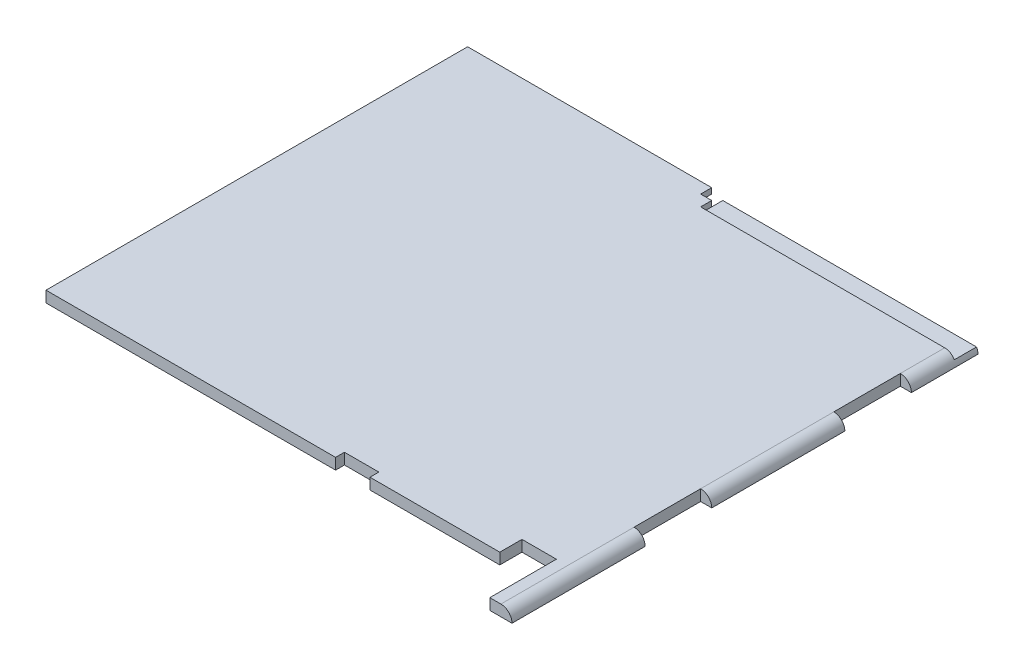
ISO-10303-21;
HEADER;
FILE_DESCRIPTION(('STEP AP214'),'2;1');
FILE_NAME('part.step','',(''),(''),'','','');
FILE_SCHEMA(('AUTOMOTIVE_DESIGN { 1 0 10303 214 1 1 1 1 }'));
ENDSEC;
DATA;
#1=APPLICATION_CONTEXT('core data for automotive mechanical design processes');
#2=APPLICATION_PROTOCOL_DEFINITION('international standard','automotive_design',2000,#1);
#3=PRODUCT_CONTEXT('',#1,'mechanical');
#4=PRODUCT('Part','Part','',(#3));
#5=PRODUCT_RELATED_PRODUCT_CATEGORY('part','',(#4));
#6=PRODUCT_DEFINITION_FORMATION('','',#4);
#7=PRODUCT_DEFINITION_CONTEXT('part definition',#1,'design');
#8=PRODUCT_DEFINITION('design','',#6,#7);
#9=PRODUCT_DEFINITION_SHAPE('','',#8);
#10=(LENGTH_UNIT() NAMED_UNIT(*) SI_UNIT(.MILLI.,.METRE.));
#11=(NAMED_UNIT(*) PLANE_ANGLE_UNIT() SI_UNIT($,.RADIAN.));
#12=(NAMED_UNIT(*) SI_UNIT($,.STERADIAN.) SOLID_ANGLE_UNIT());
#13=UNCERTAINTY_MEASURE_WITH_UNIT(LENGTH_MEASURE(1.E-05),#10,'distance_accuracy_value','');
#14=(GEOMETRIC_REPRESENTATION_CONTEXT(3) GLOBAL_UNCERTAINTY_ASSIGNED_CONTEXT((#13)) GLOBAL_UNIT_ASSIGNED_CONTEXT((#10,
#11,#12)) REPRESENTATION_CONTEXT('',''));
#15=CARTESIAN_POINT('',(0.,0.,0.));
#16=DIRECTION('',(0.,0.,1.));
#17=DIRECTION('',(1.,0.,0.));
#18=AXIS2_PLACEMENT_3D('',#15,#16,#17);
#19=CARTESIAN_POINT('',(-36.2537132824313,0.,76.4649026606249));
#20=DIRECTION('',(0.,0.,1.));
#21=DIRECTION('',(1.,0.,0.));
#22=AXIS2_PLACEMENT_3D('',#19,#20,#21);
#23=PLANE('',#22);
#24=DIRECTION('',(1.,0.,0.));
#25=VECTOR('',#24,1.);
#26=CARTESIAN_POINT('',(-36.2537132824313,0.,76.4649026606249));
#27=LINE('',#26,#25);
#28=CARTESIAN_POINT('',(93.7462867175687,0.,76.4649026606249));
#29=VERTEX_POINT('',#28);
#30=CARTESIAN_POINT('',(208.746286717569,0.,76.4649026606249));
#31=VERTEX_POINT('',#30);
#32=EDGE_CURVE('E652',#29,#31,#27,.T.);
#33=ORIENTED_EDGE('',*,*,#32,.F.);
#34=DIRECTION('',(0.,-1.,0.));
#35=VECTOR('',#34,1.);
#36=CARTESIAN_POINT('',(93.7462867175687,5.,76.4649026606249));
#37=LINE('',#36,#35);
#38=CARTESIAN_POINT('',(93.7462867175687,2.5,76.4649026606249));
#39=VERTEX_POINT('',#38);
#40=EDGE_CURVE('E596',#39,#29,#37,.T.);
#41=ORIENTED_EDGE('',*,*,#40,.F.);
#42=DIRECTION('',(1.,0.,0.));
#43=VECTOR('',#42,1.);
#44=CARTESIAN_POINT('',(-36.2537132824313,2.50000000000002,76.4649026606249));
#45=LINE('',#44,#43);
#46=CARTESIAN_POINT('',(208.076413736491,2.49999999999999,76.4649026606249));
#47=VERTEX_POINT('',#46);
#48=EDGE_CURVE('E410',#39,#47,#45,.T.);
#49=ORIENTED_EDGE('',*,*,#48,.T.);
#50=CARTESIAN_POINT('',(203.746286717569,0.,76.4649026606249));
#51=DIRECTION('',(0.,0.,1.));
#52=DIRECTION('',(1.,0.,0.));
#53=AXIS2_PLACEMENT_3D('',#50,#51,#52);
#54=CIRCLE('',#53,5.);
#55=EDGE_CURVE('E791',#47,#31,#54,.F.);
#56=ORIENTED_EDGE('',*,*,#55,.T.);
#57=EDGE_LOOP('',(#33,#41,#49,#56));
#58=FACE_BOUND('',#57,.T.);
#59=ADVANCED_FACE('F402',(#58),#23,.F.);
#60=CARTESIAN_POINT('',(93.7462867175687,2.5,86.4649026606249));
#61=DIRECTION('',(-1.,0.,0.));
#62=DIRECTION('',(0.,0.,1.));
#63=AXIS2_PLACEMENT_3D('',#60,#61,#62);
#64=PLANE('',#63);
#65=DIRECTION('',(0.,-1.,0.));
#66=VECTOR('',#65,1.);
#67=CARTESIAN_POINT('',(93.7462867175687,5.,81.4649026606249));
#68=LINE('',#67,#66);
#69=CARTESIAN_POINT('',(93.7462867175687,5.,81.4649026606249));
#70=VERTEX_POINT('',#69);
#71=CARTESIAN_POINT('',(93.7462867175687,2.5,81.4649026606249));
#72=VERTEX_POINT('',#71);
#73=EDGE_CURVE('E587',#70,#72,#68,.T.);
#74=ORIENTED_EDGE('',*,*,#73,.F.);
#75=DIRECTION('',(0.,0.,-1.));
#76=VECTOR('',#75,1.);
#77=CARTESIAN_POINT('',(93.7462867175687,5.,86.4649026606249));
#78=LINE('',#77,#76);
#79=CARTESIAN_POINT('',(93.7462867175687,5.,86.4649026606249));
#80=VERTEX_POINT('',#79);
#81=EDGE_CURVE('E638',#80,#70,#78,.T.);
#82=ORIENTED_EDGE('',*,*,#81,.F.);
#83=DIRECTION('',(0.,1.,0.));
#84=VECTOR('',#83,1.);
#85=CARTESIAN_POINT('',(93.7462867175687,2.5,86.4649026606249));
#86=LINE('',#85,#84);
#87=CARTESIAN_POINT('',(93.7462867175687,2.5,86.4649026606249));
#88=VERTEX_POINT('',#87);
#89=EDGE_CURVE('E631',#88,#80,#86,.T.);
#90=ORIENTED_EDGE('',*,*,#89,.F.);
#91=DIRECTION('',(0.,0.,-1.));
#92=VECTOR('',#91,1.);
#93=CARTESIAN_POINT('',(93.7462867175687,2.5,86.4649026606249));
#94=LINE('',#93,#92);
#95=EDGE_CURVE('E642',#88,#72,#94,.T.);
#96=ORIENTED_EDGE('',*,*,#95,.T.);
#97=EDGE_LOOP('',(#74,#82,#90,#96));
#98=FACE_BOUND('',#97,.T.);
#99=ADVANCED_FACE('F896',(#98),#64,.F.);
#100=CARTESIAN_POINT('',(88.7462867175687,0.,86.4649026606249));
#101=DIRECTION('',(1.,0.,0.));
#102=DIRECTION('',(0.,0.,-1.));
#103=AXIS2_PLACEMENT_3D('',#100,#101,#102);
#104=PLANE('',#103);
#105=DIRECTION('',(0.,1.,0.));
#106=VECTOR('',#105,1.);
#107=CARTESIAN_POINT('',(88.7462867175687,5.,81.4649026606249));
#108=LINE('',#107,#106);
#109=CARTESIAN_POINT('',(88.7462867175687,0.,81.4649026606249));
#110=VERTEX_POINT('',#109);
#111=CARTESIAN_POINT('',(88.7462867175687,2.5,81.4649026606249));
#112=VERTEX_POINT('',#111);
#113=EDGE_CURVE('E417',#110,#112,#108,.T.);
#114=ORIENTED_EDGE('',*,*,#113,.F.);
#115=DIRECTION('',(0.,0.,-1.));
#116=VECTOR('',#115,1.);
#117=CARTESIAN_POINT('',(88.7462867175687,0.,86.4649026606249));
#118=LINE('',#117,#116);
#119=CARTESIAN_POINT('',(88.7462867175687,0.,86.4649026606249));
#120=VERTEX_POINT('',#119);
#121=EDGE_CURVE('E605',#120,#110,#118,.T.);
#122=ORIENTED_EDGE('',*,*,#121,.F.);
#123=DIRECTION('',(0.,-1.,0.));
#124=VECTOR('',#123,1.);
#125=CARTESIAN_POINT('',(88.7462867175687,0.,86.4649026606249));
#126=LINE('',#125,#124);
#127=CARTESIAN_POINT('',(88.7462867175687,2.5,86.4649026606249));
#128=VERTEX_POINT('',#127);
#129=EDGE_CURVE('E623',#128,#120,#126,.T.);
#130=ORIENTED_EDGE('',*,*,#129,.F.);
#131=DIRECTION('',(0.,0.,-1.));
#132=VECTOR('',#131,1.);
#133=CARTESIAN_POINT('',(88.7462867175687,2.5,86.4649026606249));
#134=LINE('',#133,#132);
#135=EDGE_CURVE('E633',#128,#112,#134,.T.);
#136=ORIENTED_EDGE('',*,*,#135,.T.);
#137=EDGE_LOOP('',(#114,#122,#130,#136));
#138=FACE_BOUND('',#137,.T.);
#139=ADVANCED_FACE('F880',(#138),#104,.F.);
#140=CARTESIAN_POINT('',(0.,5.,286.464902660625));
#141=DIRECTION('',(0.,0.,-1.));
#142=DIRECTION('',(-1.,0.,0.));
#143=AXIS2_PLACEMENT_3D('',#140,#141,#142);
#144=PLANE('',#143);
#145=DIRECTION('',(1.,0.,0.));
#146=VECTOR('',#145,1.);
#147=CARTESIAN_POINT('',(0.,0.,286.464902660625));
#148=LINE('',#147,#146);
#149=CARTESIAN_POINT('',(198.746286717569,0.,286.464902660625));
#150=VERTEX_POINT('',#149);
#151=CARTESIAN_POINT('',(208.746286717569,0.,286.464902660625));
#152=VERTEX_POINT('',#151);
#153=EDGE_CURVE('E698',#150,#152,#148,.T.);
#154=ORIENTED_EDGE('',*,*,#153,.T.);
#155=CARTESIAN_POINT('',(203.746286717569,0.,286.464902660625));
#156=DIRECTION('',(0.,0.,-1.));
#157=DIRECTION('',(-1.,0.,0.));
#158=AXIS2_PLACEMENT_3D('',#155,#156,#157);
#159=CIRCLE('',#158,5.);
#160=CARTESIAN_POINT('',(203.746286717569,5.,286.464902660625));
#161=VERTEX_POINT('',#160);
#162=EDGE_CURVE('E789',#152,#161,#159,.F.);
#163=ORIENTED_EDGE('',*,*,#162,.T.);
#164=DIRECTION('',(1.,0.,0.));
#165=VECTOR('',#164,1.);
#166=CARTESIAN_POINT('',(0.,5.,286.464902660625));
#167=LINE('',#166,#165);
#168=CARTESIAN_POINT('',(198.746286717569,5.,286.464902660625));
#169=VERTEX_POINT('',#168);
#170=EDGE_CURVE('E662',#169,#161,#167,.T.);
#171=ORIENTED_EDGE('',*,*,#170,.F.);
#172=DIRECTION('',(0.,-1.,0.));
#173=VECTOR('',#172,1.);
#174=CARTESIAN_POINT('',(198.746286717569,5.,286.464902660625));
#175=LINE('',#174,#173);
#176=EDGE_CURVE('E751',#169,#150,#175,.T.);
#177=ORIENTED_EDGE('',*,*,#176,.T.);
#178=EDGE_LOOP('',(#154,#163,#171,#177));
#179=FACE_BOUND('',#178,.T.);
#180=ADVANCED_FACE('F835',(#179),#144,.F.);
#181=CARTESIAN_POINT('',(0.,5.,226.464902660625));
#182=DIRECTION('',(0.,0.,-1.));
#183=DIRECTION('',(-1.,0.,0.));
#184=AXIS2_PLACEMENT_3D('',#181,#182,#183);
#185=PLANE('',#184);
#186=DIRECTION('',(0.,-1.,0.));
#187=VECTOR('',#186,1.);
#188=CARTESIAN_POINT('',(203.746286717569,5.,226.464902660625));
#189=LINE('',#188,#187);
#190=CARTESIAN_POINT('',(203.746286717569,5.,226.464902660625));
#191=VERTEX_POINT('',#190);
#192=CARTESIAN_POINT('',(203.746286717569,0.,226.464902660625));
#193=VERTEX_POINT('',#192);
#194=EDGE_CURVE('E748',#191,#193,#189,.T.);
#195=ORIENTED_EDGE('',*,*,#194,.F.);
#196=CARTESIAN_POINT('',(203.746286717569,0.,226.464902660625));
#197=DIRECTION('',(0.,0.,-1.));
#198=DIRECTION('',(-1.,0.,0.));
#199=AXIS2_PLACEMENT_3D('',#196,#197,#198);
#200=CIRCLE('',#199,5.);
#201=CARTESIAN_POINT('',(208.746286717569,0.,226.464902660625));
#202=VERTEX_POINT('',#201);
#203=EDGE_CURVE('E787',#191,#202,#200,.T.);
#204=ORIENTED_EDGE('',*,*,#203,.T.);
#205=DIRECTION('',(1.,0.,0.));
#206=VECTOR('',#205,1.);
#207=CARTESIAN_POINT('',(0.,0.,226.464902660625));
#208=LINE('',#207,#206);
#209=EDGE_CURVE('E704',#193,#202,#208,.T.);
#210=ORIENTED_EDGE('',*,*,#209,.F.);
#211=EDGE_LOOP('',(#195,#204,#210));
#212=FACE_BOUND('',#211,.T.);
#213=ADVANCED_FACE('F827',(#212),#185,.T.);
#214=CARTESIAN_POINT('',(203.746286717569,5.,0.));
#215=DIRECTION('',(1.,0.,0.));
#216=DIRECTION('',(0.,0.,-1.));
#217=AXIS2_PLACEMENT_3D('',#214,#215,#216);
#218=PLANE('',#217);
#219=DIRECTION('',(0.,0.,1.));
#220=VECTOR('',#219,1.);
#221=CARTESIAN_POINT('',(203.746286717569,0.,0.));
#222=LINE('',#221,#220);
#223=CARTESIAN_POINT('',(203.746286717569,0.,196.464902660625));
#224=VERTEX_POINT('',#223);
#225=EDGE_CURVE('E707',#224,#193,#222,.T.);
#226=ORIENTED_EDGE('',*,*,#225,.F.);
#227=DIRECTION('',(0.,1.,0.));
#228=VECTOR('',#227,1.);
#229=CARTESIAN_POINT('',(203.746286717569,5.,196.464902660625));
#230=LINE('',#229,#228);
#231=CARTESIAN_POINT('',(203.746286717569,5.,196.464902660625));
#232=VERTEX_POINT('',#231);
#233=EDGE_CURVE('E756',#224,#232,#230,.T.);
#234=ORIENTED_EDGE('',*,*,#233,.T.);
#235=DIRECTION('',(0.,0.,1.));
#236=VECTOR('',#235,1.);
#237=CARTESIAN_POINT('',(203.746286717569,5.,0.));
#238=LINE('',#237,#236);
#239=EDGE_CURVE('E666',#232,#191,#238,.T.);
#240=ORIENTED_EDGE('',*,*,#239,.T.);
#241=ORIENTED_EDGE('',*,*,#194,.T.);
#242=EDGE_LOOP('',(#226,#234,#240,#241));
#243=FACE_BOUND('',#242,.T.);
#244=ADVANCED_FACE('F822',(#243),#218,.T.);
#245=CARTESIAN_POINT('',(203.746286717569,5.,106.464902660625));
#246=VERTEX_POINT('',#245);
#247=CARTESIAN_POINT('',(203.746286717569,5.,136.464902660625));
#248=VERTEX_POINT('',#247);
#249=EDGE_CURVE('E669',#246,#248,#238,.T.);
#250=ORIENTED_EDGE('',*,*,#249,.T.);
#251=DIRECTION('',(0.,-1.,0.));
#252=VECTOR('',#251,1.);
#253=CARTESIAN_POINT('',(203.746286717569,5.,136.464902660625));
#254=LINE('',#253,#252);
#255=CARTESIAN_POINT('',(203.746286717569,0.,136.464902660625));
#256=VERTEX_POINT('',#255);
#257=EDGE_CURVE('E759',#248,#256,#254,.T.);
#258=ORIENTED_EDGE('',*,*,#257,.T.);
#259=CARTESIAN_POINT('',(203.746286717569,0.,106.464902660625));
#260=VERTEX_POINT('',#259);
#261=EDGE_CURVE('E709',#260,#256,#222,.T.);
#262=ORIENTED_EDGE('',*,*,#261,.F.);
#263=DIRECTION('',(0.,1.,0.));
#264=VECTOR('',#263,1.);
#265=CARTESIAN_POINT('',(203.746286717569,5.,106.464902660625));
#266=LINE('',#265,#264);
#267=EDGE_CURVE('E753',#260,#246,#266,.T.);
#268=ORIENTED_EDGE('',*,*,#267,.T.);
#269=EDGE_LOOP('',(#250,#258,#262,#268));
#270=FACE_BOUND('',#269,.T.);
#271=ADVANCED_FACE('F806',(#270),#218,.T.);
#272=CARTESIAN_POINT('',(-21.2537132824313,5.,0.));
#273=DIRECTION('',(-1.,0.,0.));
#274=DIRECTION('',(0.,0.,1.));
#275=AXIS2_PLACEMENT_3D('',#272,#273,#274);
#276=PLANE('',#275);
#277=DIRECTION('',(0.,0.,-1.));
#278=VECTOR('',#277,1.);
#279=CARTESIAN_POINT('',(-21.2537132824313,2.5,86.4649026606249));
#280=LINE('',#279,#278);
#281=CARTESIAN_POINT('',(-21.2537132824313,2.5,86.4649026606249));
#282=VERTEX_POINT('',#281);
#283=CARTESIAN_POINT('',(-21.2537132824313,2.5,76.4649026606249));
#284=VERTEX_POINT('',#283);
#285=EDGE_CURVE('E628',#282,#284,#280,.T.);
#286=ORIENTED_EDGE('',*,*,#285,.F.);
#287=DIRECTION('',(0.,1.,0.));
#288=VECTOR('',#287,1.);
#289=CARTESIAN_POINT('',(-21.2537132824313,0.,86.4649026606249));
#290=LINE('',#289,#288);
#291=CARTESIAN_POINT('',(-21.2537132824313,0.,86.4649026606249));
#292=VERTEX_POINT('',#291);
#293=EDGE_CURVE('E616',#292,#282,#290,.T.);
#294=ORIENTED_EDGE('',*,*,#293,.F.);
#295=DIRECTION('',(0.,0.,-1.));
#296=VECTOR('',#295,1.);
#297=CARTESIAN_POINT('',(-21.2537132824313,0.,0.));
#298=LINE('',#297,#296);
#299=CARTESIAN_POINT('',(-21.2537132824313,0.,266.464902660625));
#300=VERTEX_POINT('',#299);
#301=EDGE_CURVE('E710',#300,#292,#298,.T.);
#302=ORIENTED_EDGE('',*,*,#301,.F.);
#303=DIRECTION('',(0.,-1.,0.));
#304=VECTOR('',#303,1.);
#305=CARTESIAN_POINT('',(-21.2537132824313,5.,266.464902660625));
#306=LINE('',#305,#304);
#307=CARTESIAN_POINT('',(-21.2537132824313,5.,266.464902660625));
#308=VERTEX_POINT('',#307);
#309=EDGE_CURVE('E746',#308,#300,#306,.T.);
#310=ORIENTED_EDGE('',*,*,#309,.F.);
#311=DIRECTION('',(0.,0.,-1.));
#312=VECTOR('',#311,1.);
#313=CARTESIAN_POINT('',(-21.2537132824313,5.,0.));
#314=LINE('',#313,#312);
#315=CARTESIAN_POINT('',(-21.2537132824313,5.,76.4649026606249));
#316=VERTEX_POINT('',#315);
#317=EDGE_CURVE('E670',#308,#316,#314,.T.);
#318=ORIENTED_EDGE('',*,*,#317,.T.);
#319=DIRECTION('',(0.,1.,0.));
#320=VECTOR('',#319,1.);
#321=CARTESIAN_POINT('',(-21.2537132824313,5.,76.4649026606249));
#322=LINE('',#321,#320);
#323=EDGE_CURVE('E654',#284,#316,#322,.T.);
#324=ORIENTED_EDGE('',*,*,#323,.F.);
#325=EDGE_LOOP('',(#286,#294,#302,#310,#318,#324));
#326=FACE_BOUND('',#325,.T.);
#327=ADVANCED_FACE('F875',(#326),#276,.T.);
#328=CARTESIAN_POINT('',(0.,5.,266.464902660625));
#329=DIRECTION('',(0.,0.,1.));
#330=DIRECTION('',(1.,0.,0.));
#331=AXIS2_PLACEMENT_3D('',#328,#329,#330);
#332=PLANE('',#331);
#333=DIRECTION('',(-1.,0.,0.));
#334=VECTOR('',#333,1.);
#335=CARTESIAN_POINT('',(0.,0.,266.464902660625));
#336=LINE('',#335,#334);
#337=CARTESIAN_POINT('',(109.246286717569,0.,266.464902660625));
#338=VERTEX_POINT('',#337);
#339=EDGE_CURVE('E713',#338,#300,#336,.T.);
#340=ORIENTED_EDGE('',*,*,#339,.F.);
#341=DIRECTION('',(0.,-1.,0.));
#342=VECTOR('',#341,1.);
#343=CARTESIAN_POINT('',(109.246286717569,5.,266.464902660625));
#344=LINE('',#343,#342);
#345=CARTESIAN_POINT('',(109.246286717569,5.,266.464902660625));
#346=VERTEX_POINT('',#345);
#347=EDGE_CURVE('E744',#346,#338,#344,.T.);
#348=ORIENTED_EDGE('',*,*,#347,.F.);
#349=DIRECTION('',(-1.,0.,0.));
#350=VECTOR('',#349,1.);
#351=CARTESIAN_POINT('',(0.,5.,266.464902660625));
#352=LINE('',#351,#350);
#353=EDGE_CURVE('E673',#346,#308,#352,.T.);
#354=ORIENTED_EDGE('',*,*,#353,.T.);
#355=ORIENTED_EDGE('',*,*,#309,.T.);
#356=EDGE_LOOP('',(#340,#348,#354,#355));
#357=FACE_BOUND('',#356,.T.);
#358=ADVANCED_FACE('F869',(#357),#332,.T.);
#359=CARTESIAN_POINT('',(109.24628671757,5.,3.79024196464522E-13));
#360=DIRECTION('',(1.,0.,0.));
#361=DIRECTION('',(0.,0.,-1.));
#362=AXIS2_PLACEMENT_3D('',#359,#360,#361);
#363=PLANE('',#362);
#364=DIRECTION('',(0.,0.,1.));
#365=VECTOR('',#364,1.);
#366=CARTESIAN_POINT('',(109.24628671757,0.,3.79024196464522E-13));
#367=LINE('',#366,#365);
#368=CARTESIAN_POINT('',(109.246286717569,0.,262.464902660625));
#369=VERTEX_POINT('',#368);
#370=EDGE_CURVE('E716',#369,#338,#367,.T.);
#371=ORIENTED_EDGE('',*,*,#370,.F.);
#372=DIRECTION('',(0.,-1.,0.));
#373=VECTOR('',#372,1.);
#374=CARTESIAN_POINT('',(109.246286717569,5.,262.464902660625));
#375=LINE('',#374,#373);
#376=CARTESIAN_POINT('',(109.246286717569,5.,262.464902660625));
#377=VERTEX_POINT('',#376);
#378=EDGE_CURVE('E742',#377,#369,#375,.T.);
#379=ORIENTED_EDGE('',*,*,#378,.F.);
#380=DIRECTION('',(0.,0.,1.));
#381=VECTOR('',#380,1.);
#382=CARTESIAN_POINT('',(109.24628671757,5.,3.79024196464522E-13));
#383=LINE('',#382,#381);
#384=EDGE_CURVE('E676',#377,#346,#383,.T.);
#385=ORIENTED_EDGE('',*,*,#384,.T.);
#386=ORIENTED_EDGE('',*,*,#347,.T.);
#387=EDGE_LOOP('',(#371,#379,#385,#386));
#388=FACE_BOUND('',#387,.T.);
#389=ADVANCED_FACE('F865',(#388),#363,.T.);
#390=CARTESIAN_POINT('',(0.,5.,262.464902660625));
#391=DIRECTION('',(0.,0.,1.));
#392=DIRECTION('',(1.,0.,0.));
#393=AXIS2_PLACEMENT_3D('',#390,#391,#392);
#394=PLANE('',#393);
#395=DIRECTION('',(-1.,0.,0.));
#396=VECTOR('',#395,1.);
#397=CARTESIAN_POINT('',(0.,0.,262.464902660625));
#398=LINE('',#397,#396);
#399=CARTESIAN_POINT('',(124.746286717569,0.,262.464902660625));
#400=VERTEX_POINT('',#399);
#401=EDGE_CURVE('E719',#400,#369,#398,.T.);
#402=ORIENTED_EDGE('',*,*,#401,.F.);
#403=DIRECTION('',(0.,-1.,0.));
#404=VECTOR('',#403,1.);
#405=CARTESIAN_POINT('',(124.746286717569,5.,262.464902660625));
#406=LINE('',#405,#404);
#407=CARTESIAN_POINT('',(124.746286717569,5.,262.464902660625));
#408=VERTEX_POINT('',#407);
#409=EDGE_CURVE('E740',#408,#400,#406,.T.);
#410=ORIENTED_EDGE('',*,*,#409,.F.);
#411=DIRECTION('',(-1.,0.,0.));
#412=VECTOR('',#411,1.);
#413=CARTESIAN_POINT('',(0.,5.,262.464902660625));
#414=LINE('',#413,#412);
#415=EDGE_CURVE('E679',#408,#377,#414,.T.);
#416=ORIENTED_EDGE('',*,*,#415,.T.);
#417=ORIENTED_EDGE('',*,*,#378,.T.);
#418=EDGE_LOOP('',(#402,#410,#416,#417));
#419=FACE_BOUND('',#418,.T.);
#420=ADVANCED_FACE('F861',(#419),#394,.T.);
#421=CARTESIAN_POINT('',(124.746286717569,5.,0.));
#422=DIRECTION('',(-1.,0.,0.));
#423=DIRECTION('',(0.,0.,1.));
#424=AXIS2_PLACEMENT_3D('',#421,#422,#423);
#425=PLANE('',#424);
#426=DIRECTION('',(0.,0.,-1.));
#427=VECTOR('',#426,1.);
#428=CARTESIAN_POINT('',(124.746286717569,0.,0.));
#429=LINE('',#428,#427);
#430=CARTESIAN_POINT('',(124.746286717569,0.,266.464902660625));
#431=VERTEX_POINT('',#430);
#432=EDGE_CURVE('E722',#431,#400,#429,.T.);
#433=ORIENTED_EDGE('',*,*,#432,.F.);
#434=DIRECTION('',(0.,-1.,0.));
#435=VECTOR('',#434,1.);
#436=CARTESIAN_POINT('',(124.746286717569,5.,266.464902660625));
#437=LINE('',#436,#435);
#438=CARTESIAN_POINT('',(124.746286717569,5.,266.464902660625));
#439=VERTEX_POINT('',#438);
#440=EDGE_CURVE('E738',#439,#431,#437,.T.);
#441=ORIENTED_EDGE('',*,*,#440,.F.);
#442=DIRECTION('',(0.,0.,-1.));
#443=VECTOR('',#442,1.);
#444=CARTESIAN_POINT('',(124.746286717569,5.,0.));
#445=LINE('',#444,#443);
#446=EDGE_CURVE('E682',#439,#408,#445,.T.);
#447=ORIENTED_EDGE('',*,*,#446,.T.);
#448=ORIENTED_EDGE('',*,*,#409,.T.);
#449=EDGE_LOOP('',(#433,#441,#447,#448));
#450=FACE_BOUND('',#449,.T.);
#451=ADVANCED_FACE('F857',(#450),#425,.T.);
#452=CARTESIAN_POINT('',(0.,5.,266.464902660625));
#453=DIRECTION('',(0.,0.,1.));
#454=DIRECTION('',(1.,0.,0.));
#455=AXIS2_PLACEMENT_3D('',#452,#453,#454);
#456=PLANE('',#455);
#457=DIRECTION('',(-1.,0.,0.));
#458=VECTOR('',#457,1.);
#459=CARTESIAN_POINT('',(0.,0.,266.464902660625));
#460=LINE('',#459,#458);
#461=CARTESIAN_POINT('',(183.246286717569,0.,266.464902660625));
#462=VERTEX_POINT('',#461);
#463=EDGE_CURVE('E725',#462,#431,#460,.T.);
#464=ORIENTED_EDGE('',*,*,#463,.F.);
#465=DIRECTION('',(0.,-1.,0.));
#466=VECTOR('',#465,1.);
#467=CARTESIAN_POINT('',(183.246286717569,5.,266.464902660625));
#468=LINE('',#467,#466);
#469=CARTESIAN_POINT('',(183.246286717569,5.,266.464902660625));
#470=VERTEX_POINT('',#469);
#471=EDGE_CURVE('E736',#470,#462,#468,.T.);
#472=ORIENTED_EDGE('',*,*,#471,.F.);
#473=DIRECTION('',(-1.,0.,0.));
#474=VECTOR('',#473,1.);
#475=CARTESIAN_POINT('',(0.,5.,266.464902660625));
#476=LINE('',#475,#474);
#477=EDGE_CURVE('E685',#470,#439,#476,.T.);
#478=ORIENTED_EDGE('',*,*,#477,.T.);
#479=ORIENTED_EDGE('',*,*,#440,.T.);
#480=EDGE_LOOP('',(#464,#472,#478,#479));
#481=FACE_BOUND('',#480,.T.);
#482=ADVANCED_FACE('F853',(#481),#456,.T.);
#483=CARTESIAN_POINT('',(183.246286717569,5.,0.));
#484=DIRECTION('',(1.,0.,0.));
#485=DIRECTION('',(0.,0.,-1.));
#486=AXIS2_PLACEMENT_3D('',#483,#484,#485);
#487=PLANE('',#486);
#488=DIRECTION('',(0.,0.,1.));
#489=VECTOR('',#488,1.);
#490=CARTESIAN_POINT('',(183.246286717569,0.,0.));
#491=LINE('',#490,#489);
#492=CARTESIAN_POINT('',(183.246286717569,0.,256.464902660625));
#493=VERTEX_POINT('',#492);
#494=EDGE_CURVE('E728',#493,#462,#491,.T.);
#495=ORIENTED_EDGE('',*,*,#494,.F.);
#496=DIRECTION('',(0.,-1.,0.));
#497=VECTOR('',#496,1.);
#498=CARTESIAN_POINT('',(183.246286717569,5.,256.464902660625));
#499=LINE('',#498,#497);
#500=CARTESIAN_POINT('',(183.246286717569,5.,256.464902660625));
#501=VERTEX_POINT('',#500);
#502=EDGE_CURVE('E734',#501,#493,#499,.T.);
#503=ORIENTED_EDGE('',*,*,#502,.F.);
#504=DIRECTION('',(0.,0.,1.));
#505=VECTOR('',#504,1.);
#506=CARTESIAN_POINT('',(183.246286717569,5.,0.));
#507=LINE('',#506,#505);
#508=EDGE_CURVE('E688',#501,#470,#507,.T.);
#509=ORIENTED_EDGE('',*,*,#508,.T.);
#510=ORIENTED_EDGE('',*,*,#471,.T.);
#511=EDGE_LOOP('',(#495,#503,#509,#510));
#512=FACE_BOUND('',#511,.T.);
#513=ADVANCED_FACE('F849',(#512),#487,.T.);
#514=CARTESIAN_POINT('',(0.,5.,256.464902660625));
#515=DIRECTION('',(0.,0.,1.));
#516=DIRECTION('',(1.,0.,0.));
#517=AXIS2_PLACEMENT_3D('',#514,#515,#516);
#518=PLANE('',#517);
#519=DIRECTION('',(-1.,0.,0.));
#520=VECTOR('',#519,1.);
#521=CARTESIAN_POINT('',(0.,0.,256.464902660625));
#522=LINE('',#521,#520);
#523=CARTESIAN_POINT('',(198.746286717569,0.,256.464902660625));
#524=VERTEX_POINT('',#523);
#525=EDGE_CURVE('E663',#524,#493,#522,.T.);
#526=ORIENTED_EDGE('',*,*,#525,.F.);
#527=DIRECTION('',(0.,-1.,0.));
#528=VECTOR('',#527,1.);
#529=CARTESIAN_POINT('',(198.746286717569,5.,256.464902660625));
#530=LINE('',#529,#528);
#531=CARTESIAN_POINT('',(198.746286717569,5.,256.464902660625));
#532=VERTEX_POINT('',#531);
#533=EDGE_CURVE('E694',#532,#524,#530,.T.);
#534=ORIENTED_EDGE('',*,*,#533,.F.);
#535=DIRECTION('',(-1.,0.,0.));
#536=VECTOR('',#535,1.);
#537=CARTESIAN_POINT('',(0.,5.,256.464902660625));
#538=LINE('',#537,#536);
#539=EDGE_CURVE('E691',#532,#501,#538,.T.);
#540=ORIENTED_EDGE('',*,*,#539,.T.);
#541=ORIENTED_EDGE('',*,*,#502,.T.);
#542=EDGE_LOOP('',(#526,#534,#540,#541));
#543=FACE_BOUND('',#542,.T.);
#544=ADVANCED_FACE('F846',(#543),#518,.T.);
#545=CARTESIAN_POINT('',(198.746286717569,5.,0.));
#546=DIRECTION('',(-1.,0.,0.));
#547=DIRECTION('',(0.,0.,1.));
#548=AXIS2_PLACEMENT_3D('',#545,#546,#547);
#549=PLANE('',#548);
#550=DIRECTION('',(0.,0.,-1.));
#551=VECTOR('',#550,1.);
#552=CARTESIAN_POINT('',(198.746286717569,0.,0.));
#553=LINE('',#552,#551);
#554=EDGE_CURVE('E695',#150,#524,#553,.T.);
#555=ORIENTED_EDGE('',*,*,#554,.F.);
#556=ORIENTED_EDGE('',*,*,#176,.F.);
#557=DIRECTION('',(0.,0.,-1.));
#558=VECTOR('',#557,1.);
#559=CARTESIAN_POINT('',(198.746286717569,5.,0.));
#560=LINE('',#559,#558);
#561=EDGE_CURVE('E659',#169,#532,#560,.T.);
#562=ORIENTED_EDGE('',*,*,#561,.T.);
#563=ORIENTED_EDGE('',*,*,#533,.T.);
#564=EDGE_LOOP('',(#555,#556,#562,#563));
#565=FACE_BOUND('',#564,.T.);
#566=ADVANCED_FACE('F843',(#565),#549,.T.);
#567=CARTESIAN_POINT('',(0.,0.,0.));
#568=DIRECTION('',(0.,1.,0.));
#569=DIRECTION('',(0.,0.,1.));
#570=AXIS2_PLACEMENT_3D('',#567,#568,#569);
#571=PLANE('',#570);
#572=DIRECTION('',(-1.,0.,0.));
#573=VECTOR('',#572,1.);
#574=CARTESIAN_POINT('',(93.7462867175687,0.,81.4649026606249));
#575=LINE('',#574,#573);
#576=CARTESIAN_POINT('',(93.7462867175687,0.,81.4649026606249));
#577=VERTEX_POINT('',#576);
#578=EDGE_CURVE('E585',#577,#110,#575,.T.);
#579=ORIENTED_EDGE('',*,*,#578,.F.);
#580=DIRECTION('',(0.,0.,-1.));
#581=VECTOR('',#580,1.);
#582=CARTESIAN_POINT('',(93.7462867175687,0.,81.4649026606249));
#583=LINE('',#582,#581);
#584=EDGE_CURVE('E593',#577,#29,#583,.T.);
#585=ORIENTED_EDGE('',*,*,#584,.T.);
#586=ORIENTED_EDGE('',*,*,#32,.T.);
#587=DIRECTION('',(0.,0.,1.));
#588=VECTOR('',#587,1.);
#589=CARTESIAN_POINT('',(208.746286717569,0.,46.4649026606249));
#590=LINE('',#589,#588);
#591=CARTESIAN_POINT('',(208.746286717569,0.,106.464902660625));
#592=VERTEX_POINT('',#591);
#593=EDGE_CURVE('E658',#31,#592,#590,.T.);
#594=ORIENTED_EDGE('',*,*,#593,.T.);
#595=DIRECTION('',(1.,0.,0.));
#596=VECTOR('',#595,1.);
#597=CARTESIAN_POINT('',(203.746286717569,0.,106.464902660625));
#598=LINE('',#597,#596);
#599=EDGE_CURVE('E764',#260,#592,#598,.T.);
#600=ORIENTED_EDGE('',*,*,#599,.F.);
#601=ORIENTED_EDGE('',*,*,#261,.T.);
#602=DIRECTION('',(1.,0.,0.));
#603=VECTOR('',#602,1.);
#604=CARTESIAN_POINT('',(203.746286717569,0.,136.464902660625));
#605=LINE('',#604,#603);
#606=CARTESIAN_POINT('',(208.746286717569,0.,136.464902660625));
#607=VERTEX_POINT('',#606);
#608=EDGE_CURVE('E760',#256,#607,#605,.T.);
#609=ORIENTED_EDGE('',*,*,#608,.T.);
#610=DIRECTION('',(0.,0.,1.));
#611=VECTOR('',#610,1.);
#612=CARTESIAN_POINT('',(208.746286717569,0.,136.464902660625));
#613=LINE('',#612,#611);
#614=CARTESIAN_POINT('',(208.746286717569,0.,196.464902660625));
#615=VERTEX_POINT('',#614);
#616=EDGE_CURVE('E763',#607,#615,#613,.T.);
#617=ORIENTED_EDGE('',*,*,#616,.T.);
#618=DIRECTION('',(1.,0.,0.));
#619=VECTOR('',#618,1.);
#620=CARTESIAN_POINT('',(203.746286717569,0.,196.464902660625));
#621=LINE('',#620,#619);
#622=EDGE_CURVE('E699',#224,#615,#621,.T.);
#623=ORIENTED_EDGE('',*,*,#622,.F.);
#624=ORIENTED_EDGE('',*,*,#225,.T.);
#625=ORIENTED_EDGE('',*,*,#209,.T.);
#626=DIRECTION('',(0.,0.,-1.));
#627=VECTOR('',#626,1.);
#628=CARTESIAN_POINT('',(208.746286717569,0.,0.));
#629=LINE('',#628,#627);
#630=EDGE_CURVE('E701',#152,#202,#629,.T.);
#631=ORIENTED_EDGE('',*,*,#630,.F.);
#632=ORIENTED_EDGE('',*,*,#153,.F.);
#633=ORIENTED_EDGE('',*,*,#554,.T.);
#634=ORIENTED_EDGE('',*,*,#525,.T.);
#635=ORIENTED_EDGE('',*,*,#494,.T.);
#636=ORIENTED_EDGE('',*,*,#463,.T.);
#637=ORIENTED_EDGE('',*,*,#432,.T.);
#638=ORIENTED_EDGE('',*,*,#401,.T.);
#639=ORIENTED_EDGE('',*,*,#370,.T.);
#640=ORIENTED_EDGE('',*,*,#339,.T.);
#641=ORIENTED_EDGE('',*,*,#301,.T.);
#642=DIRECTION('',(-1.,0.,0.));
#643=VECTOR('',#642,1.);
#644=CARTESIAN_POINT('',(-21.2537132824313,0.,86.4649026606249));
#645=LINE('',#644,#643);
#646=EDGE_CURVE('E626',#120,#292,#645,.T.);
#647=ORIENTED_EDGE('',*,*,#646,.F.);
#648=ORIENTED_EDGE('',*,*,#121,.T.);
#649=EDGE_LOOP('',(#579,#585,#586,#594,#600,#601,#609,#617,#623,#624,#625,#631,#632,#633,#634,
#635,#636,#637,#638,#639,#640,#641,#647,#648));
#650=FACE_BOUND('',#649,.T.);
#651=ADVANCED_FACE('F603',(#650),#571,.F.);
#652=CARTESIAN_POINT('',(0.,5.,0.));
#653=DIRECTION('',(0.,1.,0.));
#654=DIRECTION('',(0.,0.,1.));
#655=AXIS2_PLACEMENT_3D('',#652,#653,#654);
#656=PLANE('',#655);
#657=DIRECTION('',(0.,0.,-1.));
#658=VECTOR('',#657,1.);
#659=CARTESIAN_POINT('',(88.7462867175687,5.,81.4649026606249));
#660=LINE('',#659,#658);
#661=CARTESIAN_POINT('',(88.7462867175687,5.,81.4649026606249));
#662=VERTEX_POINT('',#661);
#663=CARTESIAN_POINT('',(88.7462867175687,5.,76.4649026606249));
#664=VERTEX_POINT('',#663);
#665=EDGE_CURVE('E599',#662,#664,#660,.T.);
#666=ORIENTED_EDGE('',*,*,#665,.T.);
#667=DIRECTION('',(1.,0.,0.));
#668=VECTOR('',#667,1.);
#669=CARTESIAN_POINT('',(-36.2537132824313,5.,76.4649026606249));
#670=LINE('',#669,#668);
#671=EDGE_CURVE('E651',#316,#664,#670,.T.);
#672=ORIENTED_EDGE('',*,*,#671,.F.);
#673=ORIENTED_EDGE('',*,*,#317,.F.);
#674=ORIENTED_EDGE('',*,*,#353,.F.);
#675=ORIENTED_EDGE('',*,*,#384,.F.);
#676=ORIENTED_EDGE('',*,*,#415,.F.);
#677=ORIENTED_EDGE('',*,*,#446,.F.);
#678=ORIENTED_EDGE('',*,*,#477,.F.);
#679=ORIENTED_EDGE('',*,*,#508,.F.);
#680=ORIENTED_EDGE('',*,*,#539,.F.);
#681=ORIENTED_EDGE('',*,*,#561,.F.);
#682=ORIENTED_EDGE('',*,*,#170,.T.);
#683=DIRECTION('',(0.,0.,-1.));
#684=VECTOR('',#683,1.);
#685=CARTESIAN_POINT('',(203.746286717569,5.,226.464902660625));
#686=LINE('',#685,#684);
#687=EDGE_CURVE('E770',#161,#191,#686,.T.);
#688=ORIENTED_EDGE('',*,*,#687,.T.);
#689=ORIENTED_EDGE('',*,*,#239,.F.);
#690=DIRECTION('',(0.,0.,1.));
#691=VECTOR('',#690,1.);
#692=CARTESIAN_POINT('',(203.746286717569,5.,0.));
#693=LINE('',#692,#691);
#694=EDGE_CURVE('E776',#232,#248,#693,.F.);
#695=ORIENTED_EDGE('',*,*,#694,.T.);
#696=ORIENTED_EDGE('',*,*,#249,.F.);
#697=DIRECTION('',(0.,0.,1.));
#698=VECTOR('',#697,1.);
#699=CARTESIAN_POINT('',(203.746286717569,5.,0.));
#700=LINE('',#699,#698);
#701=CARTESIAN_POINT('',(203.746286717569,4.99999999999997,86.4649026606249));
#702=VERTEX_POINT('',#701);
#703=EDGE_CURVE('E778',#246,#702,#700,.F.);
#704=ORIENTED_EDGE('',*,*,#703,.T.);
#705=DIRECTION('',(1.,0.,0.));
#706=VECTOR('',#705,1.);
#707=CARTESIAN_POINT('',(93.7462867175687,5.,86.4649026606249));
#708=LINE('',#707,#706);
#709=EDGE_CURVE('E646',#80,#702,#708,.T.);
#710=ORIENTED_EDGE('',*,*,#709,.F.);
#711=ORIENTED_EDGE('',*,*,#81,.T.);
#712=DIRECTION('',(1.,0.,0.));
#713=VECTOR('',#712,1.);
#714=CARTESIAN_POINT('',(93.7462867175687,5.,81.4649026606249));
#715=LINE('',#714,#713);
#716=EDGE_CURVE('E600',#662,#70,#715,.T.);
#717=ORIENTED_EDGE('',*,*,#716,.F.);
#718=EDGE_LOOP('',(#666,#672,#673,#674,#675,#676,#677,#678,#679,#680,#681,#682,#688,#689,#695,
#696,#704,#710,#711,#717));
#719=FACE_BOUND('',#718,.T.);
#720=ADVANCED_FACE('F838',(#719),#656,.T.);
#721=CARTESIAN_POINT('',(203.746286717569,5.,106.464902660625));
#722=DIRECTION('',(0.,0.,-1.));
#723=DIRECTION('',(-1.,0.,0.));
#724=AXIS2_PLACEMENT_3D('',#721,#722,#723);
#725=PLANE('',#724);
#726=ORIENTED_EDGE('',*,*,#599,.T.);
#727=CARTESIAN_POINT('',(203.746286717569,0.,106.464902660625));
#728=DIRECTION('',(0.,0.,-1.));
#729=DIRECTION('',(-1.,0.,0.));
#730=AXIS2_PLACEMENT_3D('',#727,#728,#729);
#731=CIRCLE('',#730,5.);
#732=EDGE_CURVE('E781',#592,#246,#731,.F.);
#733=ORIENTED_EDGE('',*,*,#732,.T.);
#734=ORIENTED_EDGE('',*,*,#267,.F.);
#735=EDGE_LOOP('',(#726,#733,#734));
#736=FACE_BOUND('',#735,.T.);
#737=ADVANCED_FACE('F933',(#736),#725,.F.);
#738=CARTESIAN_POINT('',(203.746286717569,5.,196.464902660625));
#739=DIRECTION('',(0.,0.,-1.));
#740=DIRECTION('',(-1.,0.,0.));
#741=AXIS2_PLACEMENT_3D('',#738,#739,#740);
#742=PLANE('',#741);
#743=ORIENTED_EDGE('',*,*,#622,.T.);
#744=CARTESIAN_POINT('',(203.746286717569,0.,196.464902660625));
#745=DIRECTION('',(0.,0.,-1.));
#746=DIRECTION('',(-1.,0.,0.));
#747=AXIS2_PLACEMENT_3D('',#744,#745,#746);
#748=CIRCLE('',#747,5.);
#749=EDGE_CURVE('E783',#615,#232,#748,.F.);
#750=ORIENTED_EDGE('',*,*,#749,.T.);
#751=ORIENTED_EDGE('',*,*,#233,.F.);
#752=EDGE_LOOP('',(#743,#750,#751));
#753=FACE_BOUND('',#752,.T.);
#754=ADVANCED_FACE('F819',(#753),#742,.F.);
#755=CARTESIAN_POINT('',(203.746286717569,5.,136.464902660625));
#756=DIRECTION('',(0.,0.,-1.));
#757=DIRECTION('',(-1.,0.,0.));
#758=AXIS2_PLACEMENT_3D('',#755,#756,#757);
#759=PLANE('',#758);
#760=ORIENTED_EDGE('',*,*,#257,.F.);
#761=CARTESIAN_POINT('',(203.746286717569,0.,136.464902660625));
#762=DIRECTION('',(0.,0.,-1.));
#763=DIRECTION('',(-1.,0.,0.));
#764=AXIS2_PLACEMENT_3D('',#761,#762,#763);
#765=CIRCLE('',#764,5.);
#766=EDGE_CURVE('E785',#248,#607,#765,.T.);
#767=ORIENTED_EDGE('',*,*,#766,.T.);
#768=ORIENTED_EDGE('',*,*,#608,.F.);
#769=EDGE_LOOP('',(#760,#767,#768));
#770=FACE_BOUND('',#769,.T.);
#771=ADVANCED_FACE('F812',(#770),#759,.T.);
#772=CARTESIAN_POINT('',(203.746286717569,0.,46.4649026606249));
#773=DIRECTION('',(0.,0.,1.));
#774=DIRECTION('',(1.,0.,0.));
#775=AXIS2_PLACEMENT_3D('',#772,#773,#774);
#776=CYLINDRICAL_SURFACE('',#775,5.);
#777=DIRECTION('',(0.,0.,1.));
#778=VECTOR('',#777,1.);
#779=CARTESIAN_POINT('',(208.076413736491,2.49999999999999,46.4649026606249));
#780=LINE('',#779,#778);
#781=CARTESIAN_POINT('',(208.076413736491,2.49999999999998,86.4649026606249));
#782=VERTEX_POINT('',#781);
#783=EDGE_CURVE('E425',#782,#47,#780,.F.);
#784=ORIENTED_EDGE('',*,*,#783,.F.);
#785=CARTESIAN_POINT('',(203.746286717569,0.,86.4649026606249));
#786=DIRECTION('',(0.,0.,-1.));
#787=DIRECTION('',(-1.,0.,0.));
#788=AXIS2_PLACEMENT_3D('',#785,#786,#787);
#789=CIRCLE('',#788,5.);
#790=EDGE_CURVE('E12',#782,#702,#789,.F.);
#791=ORIENTED_EDGE('',*,*,#790,.T.);
#792=ORIENTED_EDGE('',*,*,#703,.F.);
#793=ORIENTED_EDGE('',*,*,#732,.F.);
#794=ORIENTED_EDGE('',*,*,#593,.F.);
#795=ORIENTED_EDGE('',*,*,#55,.F.);
#796=EDGE_LOOP('',(#784,#791,#792,#793,#794,#795));
#797=FACE_BOUND('',#796,.T.);
#798=ADVANCED_FACE('F797',(#797),#776,.T.);
#799=CARTESIAN_POINT('',(203.746286717569,0.,136.464902660625));
#800=DIRECTION('',(0.,0.,1.));
#801=DIRECTION('',(1.,0.,0.));
#802=AXIS2_PLACEMENT_3D('',#799,#800,#801);
#803=CYLINDRICAL_SURFACE('',#802,5.);
#804=ORIENTED_EDGE('',*,*,#766,.F.);
#805=ORIENTED_EDGE('',*,*,#694,.F.);
#806=ORIENTED_EDGE('',*,*,#749,.F.);
#807=ORIENTED_EDGE('',*,*,#616,.F.);
#808=EDGE_LOOP('',(#804,#805,#806,#807));
#809=FACE_BOUND('',#808,.T.);
#810=ADVANCED_FACE('F816',(#809),#803,.T.);
#811=CARTESIAN_POINT('',(203.746286717569,0.,0.));
#812=DIRECTION('',(0.,0.,1.));
#813=DIRECTION('',(1.,0.,0.));
#814=AXIS2_PLACEMENT_3D('',#811,#812,#813);
#815=CYLINDRICAL_SURFACE('',#814,5.);
#816=ORIENTED_EDGE('',*,*,#162,.F.);
#817=ORIENTED_EDGE('',*,*,#630,.T.);
#818=ORIENTED_EDGE('',*,*,#203,.F.);
#819=ORIENTED_EDGE('',*,*,#687,.F.);
#820=EDGE_LOOP('',(#816,#817,#818,#819));
#821=FACE_BOUND('',#820,.T.);
#822=ADVANCED_FACE('F404',(#821),#815,.T.);
#823=ORIENTED_EDGE('',*,*,#671,.T.);
#824=DIRECTION('',(0.,1.,0.));
#825=VECTOR('',#824,1.);
#826=CARTESIAN_POINT('',(88.7462867175687,5.,76.4649026606249));
#827=LINE('',#826,#825);
#828=CARTESIAN_POINT('',(88.7462867175687,2.5,76.4649026606249));
#829=VERTEX_POINT('',#828);
#830=EDGE_CURVE('E590',#829,#664,#827,.T.);
#831=ORIENTED_EDGE('',*,*,#830,.F.);
#832=DIRECTION('',(1.,0.,0.));
#833=VECTOR('',#832,1.);
#834=CARTESIAN_POINT('',(-21.2537132824313,2.5,76.4649026606249));
#835=LINE('',#834,#833);
#836=EDGE_CURVE('E620',#284,#829,#835,.T.);
#837=ORIENTED_EDGE('',*,*,#836,.F.);
#838=ORIENTED_EDGE('',*,*,#323,.T.);
#839=EDGE_LOOP('',(#823,#831,#837,#838));
#840=FACE_BOUND('',#839,.T.);
#841=ADVANCED_FACE('F890',(#840),#23,.F.);
#842=CARTESIAN_POINT('',(93.7462867175687,2.5,86.4649026606249));
#843=DIRECTION('',(0.,-1.,0.));
#844=DIRECTION('',(1.,0.,0.));
#845=AXIS2_PLACEMENT_3D('',#842,#843,#844);
#846=PLANE('',#845);
#847=ORIENTED_EDGE('',*,*,#783,.T.);
#848=ORIENTED_EDGE('',*,*,#48,.F.);
#849=EDGE_CURVE('E614',#72,#39,#94,.T.);
#850=ORIENTED_EDGE('',*,*,#849,.F.);
#851=ORIENTED_EDGE('',*,*,#95,.F.);
#852=DIRECTION('',(-1.,0.,0.));
#853=VECTOR('',#852,1.);
#854=CARTESIAN_POINT('',(93.7462867175687,2.5,86.4649026606249));
#855=LINE('',#854,#853);
#856=EDGE_CURVE('E641',#782,#88,#855,.T.);
#857=ORIENTED_EDGE('',*,*,#856,.F.);
#858=EDGE_LOOP('',(#847,#848,#850,#851,#857));
#859=FACE_BOUND('',#858,.T.);
#860=ADVANCED_FACE('F899',(#859),#846,.F.);
#861=CARTESIAN_POINT('',(0.,0.,86.4649026606249));
#862=DIRECTION('',(0.,0.,-1.));
#863=DIRECTION('',(-1.,0.,0.));
#864=AXIS2_PLACEMENT_3D('',#861,#862,#863);
#865=PLANE('',#864);
#866=ORIENTED_EDGE('',*,*,#856,.T.);
#867=ORIENTED_EDGE('',*,*,#89,.T.);
#868=ORIENTED_EDGE('',*,*,#709,.T.);
#869=ORIENTED_EDGE('',*,*,#790,.F.);
#870=EDGE_LOOP('',(#866,#867,#868,#869));
#871=FACE_BOUND('',#870,.T.);
#872=ADVANCED_FACE('F901',(#871),#865,.T.);
#873=CARTESIAN_POINT('',(-21.2537132824313,2.5,86.4649026606249));
#874=DIRECTION('',(0.,1.,0.));
#875=DIRECTION('',(0.,0.,1.));
#876=AXIS2_PLACEMENT_3D('',#873,#874,#875);
#877=PLANE('',#876);
#878=ORIENTED_EDGE('',*,*,#836,.T.);
#879=EDGE_CURVE('E636',#112,#829,#134,.T.);
#880=ORIENTED_EDGE('',*,*,#879,.F.);
#881=ORIENTED_EDGE('',*,*,#135,.F.);
#882=DIRECTION('',(1.,0.,0.));
#883=VECTOR('',#882,1.);
#884=CARTESIAN_POINT('',(-21.2537132824313,2.5,86.4649026606249));
#885=LINE('',#884,#883);
#886=EDGE_CURVE('E619',#282,#128,#885,.T.);
#887=ORIENTED_EDGE('',*,*,#886,.F.);
#888=ORIENTED_EDGE('',*,*,#285,.T.);
#889=EDGE_LOOP('',(#878,#880,#881,#887,#888));
#890=FACE_BOUND('',#889,.T.);
#891=ADVANCED_FACE('F883',(#890),#877,.F.);
#892=CARTESIAN_POINT('',(0.,0.,86.4649026606249));
#893=DIRECTION('',(0.,0.,-1.));
#894=DIRECTION('',(-1.,0.,0.));
#895=AXIS2_PLACEMENT_3D('',#892,#893,#894);
#896=PLANE('',#895);
#897=ORIENTED_EDGE('',*,*,#293,.T.);
#898=ORIENTED_EDGE('',*,*,#886,.T.);
#899=ORIENTED_EDGE('',*,*,#129,.T.);
#900=ORIENTED_EDGE('',*,*,#646,.T.);
#901=EDGE_LOOP('',(#897,#898,#899,#900));
#902=FACE_BOUND('',#901,.T.);
#903=ADVANCED_FACE('F877',(#902),#896,.T.);
#904=CARTESIAN_POINT('',(93.7462867175687,5.,81.4649026606249));
#905=DIRECTION('',(1.,0.,0.));
#906=DIRECTION('',(0.,0.,-1.));
#907=AXIS2_PLACEMENT_3D('',#904,#905,#906);
#908=PLANE('',#907);
#909=ORIENTED_EDGE('',*,*,#40,.T.);
#910=ORIENTED_EDGE('',*,*,#584,.F.);
#911=EDGE_CURVE('E581',#72,#577,#68,.T.);
#912=ORIENTED_EDGE('',*,*,#911,.F.);
#913=ORIENTED_EDGE('',*,*,#849,.T.);
#914=EDGE_LOOP('',(#909,#910,#912,#913));
#915=FACE_BOUND('',#914,.T.);
#916=ADVANCED_FACE('F594',(#915),#908,.F.);
#917=CARTESIAN_POINT('',(88.7462867175687,5.,81.4649026606249));
#918=DIRECTION('',(-1.,0.,0.));
#919=DIRECTION('',(0.,0.,1.));
#920=AXIS2_PLACEMENT_3D('',#917,#918,#919);
#921=PLANE('',#920);
#922=ORIENTED_EDGE('',*,*,#830,.T.);
#923=ORIENTED_EDGE('',*,*,#665,.F.);
#924=EDGE_CURVE('E606',#112,#662,#108,.T.);
#925=ORIENTED_EDGE('',*,*,#924,.F.);
#926=ORIENTED_EDGE('',*,*,#879,.T.);
#927=EDGE_LOOP('',(#922,#923,#925,#926));
#928=FACE_BOUND('',#927,.T.);
#929=ADVANCED_FACE('F887',(#928),#921,.F.);
#930=CARTESIAN_POINT('',(0.,0.,81.4649026606249));
#931=DIRECTION('',(0.,0.,-1.));
#932=DIRECTION('',(-1.,0.,0.));
#933=AXIS2_PLACEMENT_3D('',#930,#931,#932);
#934=PLANE('',#933);
#935=ORIENTED_EDGE('',*,*,#73,.T.);
#936=ORIENTED_EDGE('',*,*,#911,.T.);
#937=ORIENTED_EDGE('',*,*,#578,.T.);
#938=ORIENTED_EDGE('',*,*,#113,.T.);
#939=ORIENTED_EDGE('',*,*,#924,.T.);
#940=ORIENTED_EDGE('',*,*,#716,.T.);
#941=EDGE_LOOP('',(#935,#936,#937,#938,#939,#940));
#942=FACE_BOUND('',#941,.T.);
#943=ADVANCED_FACE('F583',(#942),#934,.T.);
#944=CLOSED_SHELL('',(#59,#99,#139,#180,#213,#244,#271,#327,#358,#389,#420,#451,#482,#513,#544,
#566,#651,#720,#737,#754,#771,#798,#810,#822,#841,#860,#872,#891,#903,#916,#929,#943));
#945=MANIFOLD_SOLID_BREP('B2',#944);
#946=ADVANCED_BREP_SHAPE_REPRESENTATION('',(#18,#945),#14);
#947=SHAPE_DEFINITION_REPRESENTATION(#9,#946);
ENDSEC;
END-ISO-10303-21;
